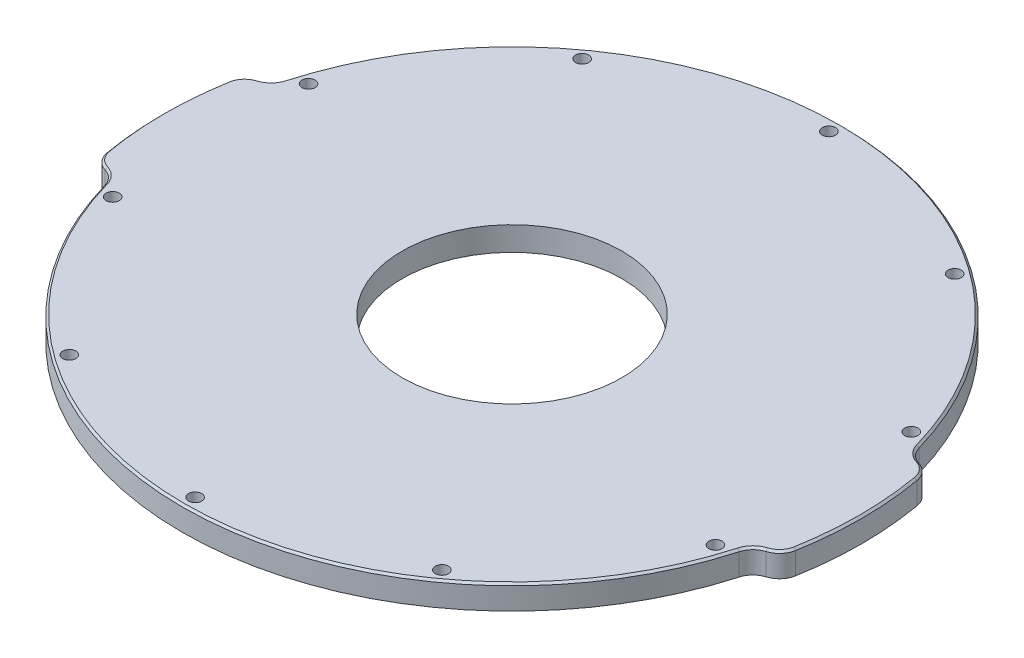
ISO-10303-21;
HEADER;
FILE_DESCRIPTION(('STEP AP214'),'2;1');
FILE_NAME('part.step','',(''),(''),'','','');
FILE_SCHEMA(('AUTOMOTIVE_DESIGN { 1 0 10303 214 1 1 1 1 }'));
ENDSEC;
DATA;
#1=APPLICATION_CONTEXT('core data for automotive mechanical design processes');
#2=APPLICATION_PROTOCOL_DEFINITION('international standard','automotive_design',2000,#1);
#3=PRODUCT_CONTEXT('',#1,'mechanical');
#4=PRODUCT('Part','Part','',(#3));
#5=PRODUCT_RELATED_PRODUCT_CATEGORY('part','',(#4));
#6=PRODUCT_DEFINITION_FORMATION('','',#4);
#7=PRODUCT_DEFINITION_CONTEXT('part definition',#1,'design');
#8=PRODUCT_DEFINITION('design','',#6,#7);
#9=PRODUCT_DEFINITION_SHAPE('','',#8);
#10=(LENGTH_UNIT() NAMED_UNIT(*) SI_UNIT(.MILLI.,.METRE.));
#11=(NAMED_UNIT(*) PLANE_ANGLE_UNIT() SI_UNIT($,.RADIAN.));
#12=(NAMED_UNIT(*) SI_UNIT($,.STERADIAN.) SOLID_ANGLE_UNIT());
#13=UNCERTAINTY_MEASURE_WITH_UNIT(LENGTH_MEASURE(1.E-05),#10,'distance_accuracy_value','');
#14=(GEOMETRIC_REPRESENTATION_CONTEXT(3) GLOBAL_UNCERTAINTY_ASSIGNED_CONTEXT((#13)) GLOBAL_UNIT_ASSIGNED_CONTEXT((#10,
#11,#12)) REPRESENTATION_CONTEXT('',''));
#15=CARTESIAN_POINT('',(0.,0.,0.));
#16=DIRECTION('',(0.,0.,1.));
#17=DIRECTION('',(1.,0.,0.));
#18=AXIS2_PLACEMENT_3D('',#15,#16,#17);
#19=CARTESIAN_POINT('',(-40.6479400055789,6.,-7.16732853320259));
#20=DIRECTION('',(0.,-1.,0.));
#21=DIRECTION('',(0.,0.,-1.));
#22=AXIS2_PLACEMENT_3D('',#19,#20,#21);
#23=PLANE('',#22);
#24=CARTESIAN_POINT('',(0.,6.,0.));
#25=DIRECTION('',(0.,1.,0.));
#26=DIRECTION('',(0.,0.,1.));
#27=AXIS2_PLACEMENT_3D('',#24,#25,#26);
#28=CIRCLE('',#27,27.5);
#29=CARTESIAN_POINT('',(0.,6.,27.5));
#30=VERTEX_POINT('',#29);
#31=EDGE_CURVE('E885',#30,#30,#28,.T.);
#32=ORIENTED_EDGE('',*,*,#31,.F.);
#33=EDGE_LOOP('',(#32));
#34=FACE_BOUND('',#33,.T.);
#35=CARTESIAN_POINT('',(84.2258492187335,6.,-23.8957909135308));
#36=DIRECTION('',(0.,-1.,0.));
#37=DIRECTION('',(0.,0.,-1.));
#38=AXIS2_PLACEMENT_3D('',#35,#36,#37);
#39=CIRCLE('',#38,5.50000000000003);
#40=CARTESIAN_POINT('',(82.6143661545668,6.,-18.6371672976115));
#41=VERTEX_POINT('',#40);
#42=CARTESIAN_POINT('',(78.9346765093898,6.,-22.3946275780149));
#43=VERTEX_POINT('',#42);
#44=EDGE_CURVE('E292',#41,#43,#39,.T.);
#45=ORIENTED_EDGE('',*,*,#44,.T.);
#46=CARTESIAN_POINT('',(0.,6.,0.));
#47=DIRECTION('',(0.,-1.,0.));
#48=DIRECTION('',(0.,0.,-1.));
#49=AXIS2_PLACEMENT_3D('',#46,#47,#48);
#50=CIRCLE('',#49,82.05);
#51=CARTESIAN_POINT('',(-78.9346765093897,6.,-22.3946275780152));
#52=VERTEX_POINT('',#51);
#53=EDGE_CURVE('E298',#43,#52,#50,.F.);
#54=ORIENTED_EDGE('',*,*,#53,.T.);
#55=CARTESIAN_POINT('',(-84.2258492187333,6.,-23.8957909135312));
#56=DIRECTION('',(0.,-1.,0.));
#57=DIRECTION('',(0.,0.,-1.));
#58=AXIS2_PLACEMENT_3D('',#55,#56,#57);
#59=CIRCLE('',#58,5.50000000000004);
#60=CARTESIAN_POINT('',(-82.6143661545668,6.,-18.6371672976118));
#61=VERTEX_POINT('',#60);
#62=EDGE_CURVE('E295',#52,#61,#59,.T.);
#63=ORIENTED_EDGE('',*,*,#62,.T.);
#64=CARTESIAN_POINT('',(-81.2958800111578,6.,-14.3346570664051));
#65=DIRECTION('',(0.,-1.,0.));
#66=DIRECTION('',(0.,0.,-1.));
#67=AXIS2_PLACEMENT_3D('',#64,#65,#66);
#68=CIRCLE('',#67,4.49999999999997);
#69=CARTESIAN_POINT('',(-85.7275148997127,6.,-15.1160738659063));
#70=VERTEX_POINT('',#69);
#71=EDGE_CURVE('E289',#61,#70,#68,.F.);
#72=ORIENTED_EDGE('',*,*,#71,.T.);
#73=CARTESIAN_POINT('',(0.,6.,0.));
#74=DIRECTION('',(0.,-1.,0.));
#75=DIRECTION('',(0.,0.,-1.));
#76=AXIS2_PLACEMENT_3D('',#73,#74,#75);
#77=CIRCLE('',#76,87.05);
#78=CARTESIAN_POINT('',(-85.7275148997127,6.,15.1160738659063));
#79=VERTEX_POINT('',#78);
#80=EDGE_CURVE('E283',#70,#79,#77,.F.);
#81=ORIENTED_EDGE('',*,*,#80,.T.);
#82=CARTESIAN_POINT('',(-81.2958800111578,6.,14.3346570664051));
#83=DIRECTION('',(0.,-1.,0.));
#84=DIRECTION('',(0.,0.,-1.));
#85=AXIS2_PLACEMENT_3D('',#82,#83,#84);
#86=CIRCLE('',#85,4.49999999999997);
#87=CARTESIAN_POINT('',(-82.6143661545668,6.,18.6371672976118));
#88=VERTEX_POINT('',#87);
#89=EDGE_CURVE('E278',#79,#88,#86,.F.);
#90=ORIENTED_EDGE('',*,*,#89,.T.);
#91=CARTESIAN_POINT('',(-84.2258492187333,6.,23.8957909135312));
#92=DIRECTION('',(0.,-1.,0.));
#93=DIRECTION('',(0.,0.,-1.));
#94=AXIS2_PLACEMENT_3D('',#91,#92,#93);
#95=CIRCLE('',#94,5.50000000000003);
#96=CARTESIAN_POINT('',(-78.9346765093897,6.,22.3946275780152));
#97=VERTEX_POINT('',#96);
#98=EDGE_CURVE('E272',#88,#97,#95,.T.);
#99=ORIENTED_EDGE('',*,*,#98,.T.);
#100=CARTESIAN_POINT('',(0.,6.,-4.92661467177413E-13));
#101=DIRECTION('',(0.,-1.,0.));
#102=DIRECTION('',(0.,0.,-1.));
#103=AXIS2_PLACEMENT_3D('',#100,#101,#102);
#104=CIRCLE('',#103,82.0500000000001);
#105=CARTESIAN_POINT('',(78.9346765093897,6.,22.3946275780149));
#106=VERTEX_POINT('',#105);
#107=EDGE_CURVE('E266',#97,#106,#104,.F.);
#108=ORIENTED_EDGE('',*,*,#107,.T.);
#109=CARTESIAN_POINT('',(84.2258492187334,6.,23.8957909135309));
#110=DIRECTION('',(0.,-1.,0.));
#111=DIRECTION('',(0.,0.,-1.));
#112=AXIS2_PLACEMENT_3D('',#109,#110,#111);
#113=CIRCLE('',#112,5.50000000000003);
#114=CARTESIAN_POINT('',(82.6143661545668,6.,18.6371672976115));
#115=VERTEX_POINT('',#114);
#116=EDGE_CURVE('E269',#106,#115,#113,.T.);
#117=ORIENTED_EDGE('',*,*,#116,.T.);
#118=CARTESIAN_POINT('',(81.2958800111578,6.,14.3346570664051));
#119=DIRECTION('',(0.,-1.,0.));
#120=DIRECTION('',(0.,0.,-1.));
#121=AXIS2_PLACEMENT_3D('',#118,#119,#120);
#122=CIRCLE('',#121,4.49999999999971);
#123=CARTESIAN_POINT('',(85.7275148997124,6.,15.1160738659063));
#124=VERTEX_POINT('',#123);
#125=EDGE_CURVE('E275',#115,#124,#122,.F.);
#126=ORIENTED_EDGE('',*,*,#125,.T.);
#127=CARTESIAN_POINT('',(-1.29063426612674E-12,6.,0.));
#128=DIRECTION('',(0.,-1.,0.));
#129=DIRECTION('',(0.,0.,-1.));
#130=AXIS2_PLACEMENT_3D('',#127,#128,#129);
#131=CIRCLE('',#130,87.050000000001);
#132=CARTESIAN_POINT('',(85.7275148997124,6.,-15.1160738659063));
#133=VERTEX_POINT('',#132);
#134=EDGE_CURVE('E281',#124,#133,#131,.F.);
#135=ORIENTED_EDGE('',*,*,#134,.T.);
#136=CARTESIAN_POINT('',(81.2958800111578,6.,-14.3346570664051));
#137=DIRECTION('',(0.,-1.,0.));
#138=DIRECTION('',(0.,0.,-1.));
#139=AXIS2_PLACEMENT_3D('',#136,#137,#138);
#140=CIRCLE('',#139,4.49999999999971);
#141=EDGE_CURVE('E286',#133,#41,#140,.F.);
#142=ORIENTED_EDGE('',*,*,#141,.T.);
#143=EDGE_LOOP('',(#45,#54,#63,#72,#81,#90,#99,#108,#117,#126,#135,#142));
#144=FACE_BOUND('',#143,.T.);
#145=CARTESIAN_POINT('',(-75.4663345680205,6.,-24.5204985036521));
#146=DIRECTION('',(0.,1.,0.));
#147=DIRECTION('',(0.,0.,1.));
#148=AXIS2_PLACEMENT_3D('',#145,#146,#147);
#149=CIRCLE('',#148,1.6500000000009);
#150=CARTESIAN_POINT('',(-75.4663345680205,6.,-22.8704985036512));
#151=VERTEX_POINT('',#150);
#152=EDGE_CURVE('E398',#151,#151,#149,.T.);
#153=ORIENTED_EDGE('',*,*,#152,.F.);
#154=EDGE_LOOP('',(#153));
#155=FACE_BOUND('',#154,.T.);
#156=CARTESIAN_POINT('',(-46.6407597694078,6.,64.1954985036521));
#157=DIRECTION('',(0.,1.,0.));
#158=DIRECTION('',(0.,0.,1.));
#159=AXIS2_PLACEMENT_3D('',#156,#157,#158);
#160=CIRCLE('',#159,1.65000000000068);
#161=CARTESIAN_POINT('',(-46.6407597694078,6.,65.8454985036528));
#162=VERTEX_POINT('',#161);
#163=EDGE_CURVE('E414',#162,#162,#160,.T.);
#164=ORIENTED_EDGE('',*,*,#163,.F.);
#165=EDGE_LOOP('',(#164));
#166=FACE_BOUND('',#165,.T.);
#167=CARTESIAN_POINT('',(46.6407597694077,6.,64.1954985036521));
#168=DIRECTION('',(0.,1.,0.));
#169=DIRECTION('',(0.,0.,1.));
#170=AXIS2_PLACEMENT_3D('',#167,#168,#169);
#171=CIRCLE('',#170,1.65000000000041);
#172=CARTESIAN_POINT('',(46.6407597694077,6.,65.8454985036525));
#173=VERTEX_POINT('',#172);
#174=EDGE_CURVE('E429',#173,#173,#171,.T.);
#175=ORIENTED_EDGE('',*,*,#174,.F.);
#176=EDGE_LOOP('',(#175));
#177=FACE_BOUND('',#176,.T.);
#178=CARTESIAN_POINT('',(75.4663345680204,6.,-24.5204985036521));
#179=DIRECTION('',(0.,1.,0.));
#180=DIRECTION('',(0.,0.,1.));
#181=AXIS2_PLACEMENT_3D('',#178,#179,#180);
#182=CIRCLE('',#181,1.65000000000021);
#183=CARTESIAN_POINT('',(75.4663345680204,6.,-22.8704985036519));
#184=VERTEX_POINT('',#183);
#185=EDGE_CURVE('E445',#184,#184,#182,.T.);
#186=ORIENTED_EDGE('',*,*,#185,.F.);
#187=EDGE_LOOP('',(#186));
#188=FACE_BOUND('',#187,.T.);
#189=CARTESIAN_POINT('',(0.,6.,-79.35));
#190=DIRECTION('',(0.,1.,0.));
#191=DIRECTION('',(0.,0.,1.));
#192=AXIS2_PLACEMENT_3D('',#189,#190,#191);
#193=CIRCLE('',#192,1.65);
#194=CARTESIAN_POINT('',(0.,6.,-77.7));
#195=VERTEX_POINT('',#194);
#196=EDGE_CURVE('E188',#195,#195,#193,.T.);
#197=ORIENTED_EDGE('',*,*,#196,.F.);
#198=EDGE_LOOP('',(#197));
#199=FACE_BOUND('',#198,.T.);
#200=CARTESIAN_POINT('',(46.6407597694078,6.,-64.1954985036521));
#201=DIRECTION('',(0.,1.,0.));
#202=DIRECTION('',(0.,0.,1.));
#203=AXIS2_PLACEMENT_3D('',#200,#201,#202);
#204=CIRCLE('',#203,1.65000000000012);
#205=CARTESIAN_POINT('',(46.6407597694078,6.,-62.5454985036519));
#206=VERTEX_POINT('',#205);
#207=EDGE_CURVE('E453',#206,#206,#204,.T.);
#208=ORIENTED_EDGE('',*,*,#207,.F.);
#209=EDGE_LOOP('',(#208));
#210=FACE_BOUND('',#209,.T.);
#211=CARTESIAN_POINT('',(75.4663345680204,6.,24.5204985036521));
#212=DIRECTION('',(0.,1.,0.));
#213=DIRECTION('',(0.,0.,1.));
#214=AXIS2_PLACEMENT_3D('',#211,#212,#213);
#215=CIRCLE('',#214,1.65000000000032);
#216=CARTESIAN_POINT('',(75.4663345680204,6.,26.1704985036524));
#217=VERTEX_POINT('',#216);
#218=EDGE_CURVE('E437',#217,#217,#215,.T.);
#219=ORIENTED_EDGE('',*,*,#218,.F.);
#220=EDGE_LOOP('',(#219));
#221=FACE_BOUND('',#220,.T.);
#222=CARTESIAN_POINT('',(0.,6.,79.35));
#223=DIRECTION('',(0.,1.,0.));
#224=DIRECTION('',(0.,0.,1.));
#225=AXIS2_PLACEMENT_3D('',#222,#223,#224);
#226=CIRCLE('',#225,1.65000000000052);
#227=CARTESIAN_POINT('',(0.,6.,81.0000000000005));
#228=VERTEX_POINT('',#227);
#229=EDGE_CURVE('E422',#228,#228,#226,.T.);
#230=ORIENTED_EDGE('',*,*,#229,.F.);
#231=EDGE_LOOP('',(#230));
#232=FACE_BOUND('',#231,.T.);
#233=CARTESIAN_POINT('',(-75.4663345680204,6.,24.5204985036521));
#234=DIRECTION('',(0.,1.,0.));
#235=DIRECTION('',(0.,0.,1.));
#236=AXIS2_PLACEMENT_3D('',#233,#234,#235);
#237=CIRCLE('',#236,1.65000000000073);
#238=CARTESIAN_POINT('',(-75.4663345680204,6.,26.1704985036528));
#239=VERTEX_POINT('',#238);
#240=EDGE_CURVE('E406',#239,#239,#237,.T.);
#241=ORIENTED_EDGE('',*,*,#240,.F.);
#242=EDGE_LOOP('',(#241));
#243=FACE_BOUND('',#242,.T.);
#244=CARTESIAN_POINT('',(-46.6407597694078,6.,-64.1954985036521));
#245=DIRECTION('',(0.,1.,0.));
#246=DIRECTION('',(0.,0.,1.));
#247=AXIS2_PLACEMENT_3D('',#244,#245,#246);
#248=CIRCLE('',#247,1.65000000000102);
#249=CARTESIAN_POINT('',(-46.6407597694078,6.,-62.545498503651));
#250=VERTEX_POINT('',#249);
#251=EDGE_CURVE('E387',#250,#250,#248,.T.);
#252=ORIENTED_EDGE('',*,*,#251,.F.);
#253=EDGE_LOOP('',(#252));
#254=FACE_BOUND('',#253,.T.);
#255=ADVANCED_FACE('F38',(#34,#144,#155,#166,#177,#188,#199,#210,#221,#232,#243,#254),#23,.F.);
#256=CARTESIAN_POINT('',(-40.6479400055789,0.,-7.16732853320259));
#257=DIRECTION('',(0.,-1.,0.));
#258=DIRECTION('',(0.,0.,-1.));
#259=AXIS2_PLACEMENT_3D('',#256,#257,#258);
#260=PLANE('',#259);
#261=CARTESIAN_POINT('',(0.,0.,0.));
#262=DIRECTION('',(0.,1.,0.));
#263=DIRECTION('',(0.,0.,1.));
#264=AXIS2_PLACEMENT_3D('',#261,#262,#263);
#265=CIRCLE('',#264,27.5);
#266=CARTESIAN_POINT('',(0.,0.,27.5));
#267=VERTEX_POINT('',#266);
#268=EDGE_CURVE('E338',#267,#267,#265,.T.);
#269=ORIENTED_EDGE('',*,*,#268,.T.);
#270=EDGE_LOOP('',(#269));
#271=FACE_BOUND('',#270,.T.);
#272=CARTESIAN_POINT('',(-75.4663345680205,0.,-24.5204985036521));
#273=DIRECTION('',(0.,1.,0.));
#274=DIRECTION('',(0.,0.,1.));
#275=AXIS2_PLACEMENT_3D('',#272,#273,#274);
#276=CIRCLE('',#275,1.6500000000009);
#277=CARTESIAN_POINT('',(-75.4663345680205,0.,-22.8704985036512));
#278=VERTEX_POINT('',#277);
#279=EDGE_CURVE('E394',#278,#278,#276,.T.);
#280=ORIENTED_EDGE('',*,*,#279,.T.);
#281=EDGE_LOOP('',(#280));
#282=FACE_BOUND('',#281,.T.);
#283=CARTESIAN_POINT('',(-46.6407597694078,0.,64.1954985036521));
#284=DIRECTION('',(0.,1.,0.));
#285=DIRECTION('',(0.,0.,1.));
#286=AXIS2_PLACEMENT_3D('',#283,#284,#285);
#287=CIRCLE('',#286,1.65000000000068);
#288=CARTESIAN_POINT('',(-46.6407597694078,0.,65.8454985036528));
#289=VERTEX_POINT('',#288);
#290=EDGE_CURVE('E410',#289,#289,#287,.T.);
#291=ORIENTED_EDGE('',*,*,#290,.T.);
#292=EDGE_LOOP('',(#291));
#293=FACE_BOUND('',#292,.T.);
#294=CARTESIAN_POINT('',(46.6407597694077,0.,64.1954985036521));
#295=DIRECTION('',(0.,1.,0.));
#296=DIRECTION('',(0.,0.,1.));
#297=AXIS2_PLACEMENT_3D('',#294,#295,#296);
#298=CIRCLE('',#297,1.65000000000041);
#299=CARTESIAN_POINT('',(46.6407597694077,0.,65.8454985036525));
#300=VERTEX_POINT('',#299);
#301=EDGE_CURVE('E425',#300,#300,#298,.T.);
#302=ORIENTED_EDGE('',*,*,#301,.T.);
#303=EDGE_LOOP('',(#302));
#304=FACE_BOUND('',#303,.T.);
#305=CARTESIAN_POINT('',(75.4663345680204,0.,-24.5204985036521));
#306=DIRECTION('',(0.,1.,0.));
#307=DIRECTION('',(0.,0.,1.));
#308=AXIS2_PLACEMENT_3D('',#305,#306,#307);
#309=CIRCLE('',#308,1.65000000000021);
#310=CARTESIAN_POINT('',(75.4663345680204,0.,-22.8704985036519));
#311=VERTEX_POINT('',#310);
#312=EDGE_CURVE('E441',#311,#311,#309,.T.);
#313=ORIENTED_EDGE('',*,*,#312,.T.);
#314=EDGE_LOOP('',(#313));
#315=FACE_BOUND('',#314,.T.);
#316=CARTESIAN_POINT('',(0.,0.,-79.35));
#317=DIRECTION('',(0.,1.,0.));
#318=DIRECTION('',(0.,0.,1.));
#319=AXIS2_PLACEMENT_3D('',#316,#317,#318);
#320=CIRCLE('',#319,1.65);
#321=CARTESIAN_POINT('',(0.,0.,-77.7));
#322=VERTEX_POINT('',#321);
#323=EDGE_CURVE('E457',#322,#322,#320,.T.);
#324=ORIENTED_EDGE('',*,*,#323,.T.);
#325=EDGE_LOOP('',(#324));
#326=FACE_BOUND('',#325,.T.);
#327=CARTESIAN_POINT('',(-81.2958800111578,0.,-14.3346570664051));
#328=DIRECTION('',(0.,1.,0.));
#329=DIRECTION('',(0.,0.,-1.));
#330=AXIS2_PLACEMENT_3D('',#327,#328,#329);
#331=CIRCLE('',#330,5.00000000000001);
#332=CARTESIAN_POINT('',(-82.7608646149456,0.,-19.1152239899681));
#333=VERTEX_POINT('',#332);
#334=CARTESIAN_POINT('',(-86.2199187762188,0.,-15.2028979547397));
#335=VERTEX_POINT('',#334);
#336=EDGE_CURVE('E181',#333,#335,#331,.T.);
#337=ORIENTED_EDGE('',*,*,#336,.F.);
#338=CARTESIAN_POINT('',(-84.2258492187333,0.,-23.8957909135312));
#339=DIRECTION('',(0.,-1.,0.));
#340=DIRECTION('',(0.,0.,-1.));
#341=AXIS2_PLACEMENT_3D('',#338,#339,#340);
#342=CIRCLE('',#341,5.);
#343=CARTESIAN_POINT('',(-79.4156922102391,0.,-22.531096972153));
#344=VERTEX_POINT('',#343);
#345=EDGE_CURVE('E260',#333,#344,#342,.F.);
#346=ORIENTED_EDGE('',*,*,#345,.T.);
#347=CARTESIAN_POINT('',(0.,0.,0.));
#348=DIRECTION('',(0.,1.,0.));
#349=DIRECTION('',(0.,0.,-1.));
#350=AXIS2_PLACEMENT_3D('',#347,#348,#349);
#351=CIRCLE('',#350,82.55);
#352=CARTESIAN_POINT('',(79.4156922102393,0.,-22.5310969721527));
#353=VERTEX_POINT('',#352);
#354=EDGE_CURVE('E217',#353,#344,#351,.T.);
#355=ORIENTED_EDGE('',*,*,#354,.F.);
#356=CARTESIAN_POINT('',(84.2258492187335,0.,-23.8957909135308));
#357=DIRECTION('',(0.,-1.,0.));
#358=DIRECTION('',(0.,0.,-1.));
#359=AXIS2_PLACEMENT_3D('',#356,#357,#358);
#360=CIRCLE('',#359,5.);
#361=CARTESIAN_POINT('',(82.7608646149456,0.,-19.1152239899679));
#362=VERTEX_POINT('',#361);
#363=EDGE_CURVE('E257',#353,#362,#360,.F.);
#364=ORIENTED_EDGE('',*,*,#363,.T.);
#365=CARTESIAN_POINT('',(81.2958800111578,0.,-14.3346570664051));
#366=DIRECTION('',(0.,1.,0.));
#367=DIRECTION('',(0.,0.,1.));
#368=AXIS2_PLACEMENT_3D('',#365,#366,#367);
#369=CIRCLE('',#368,4.99999999999974);
#370=CARTESIAN_POINT('',(86.2199187762185,0.,-15.2028979547397));
#371=VERTEX_POINT('',#370);
#372=EDGE_CURVE('E213',#371,#362,#369,.T.);
#373=ORIENTED_EDGE('',*,*,#372,.F.);
#374=CARTESIAN_POINT('',(-1.29063426612674E-12,0.,0.));
#375=DIRECTION('',(0.,1.,0.));
#376=DIRECTION('',(0.,0.,1.));
#377=AXIS2_PLACEMENT_3D('',#374,#375,#376);
#378=CIRCLE('',#377,87.550000000001);
#379=CARTESIAN_POINT('',(86.2199187762186,0.,15.2028979547397));
#380=VERTEX_POINT('',#379);
#381=EDGE_CURVE('E209',#380,#371,#378,.T.);
#382=ORIENTED_EDGE('',*,*,#381,.F.);
#383=CARTESIAN_POINT('',(81.2958800111578,0.,14.3346570664051));
#384=DIRECTION('',(0.,1.,0.));
#385=DIRECTION('',(0.,0.,-1.));
#386=AXIS2_PLACEMENT_3D('',#383,#384,#385);
#387=CIRCLE('',#386,4.99999999999974);
#388=CARTESIAN_POINT('',(82.7608646149456,0.,19.1152239899679));
#389=VERTEX_POINT('',#388);
#390=EDGE_CURVE('E205',#389,#380,#387,.T.);
#391=ORIENTED_EDGE('',*,*,#390,.F.);
#392=CARTESIAN_POINT('',(84.2258492187334,0.,23.8957909135309));
#393=DIRECTION('',(0.,-1.,0.));
#394=DIRECTION('',(0.,0.,-1.));
#395=AXIS2_PLACEMENT_3D('',#392,#393,#394);
#396=CIRCLE('',#395,5.);
#397=CARTESIAN_POINT('',(79.4156922102392,0.,22.5310969721527));
#398=VERTEX_POINT('',#397);
#399=EDGE_CURVE('E254',#389,#398,#396,.F.);
#400=ORIENTED_EDGE('',*,*,#399,.T.);
#401=CARTESIAN_POINT('',(0.,0.,-4.92661467177413E-13));
#402=DIRECTION('',(0.,1.,0.));
#403=DIRECTION('',(0.,0.,-1.));
#404=AXIS2_PLACEMENT_3D('',#401,#402,#403);
#405=CIRCLE('',#404,82.5500000000001);
#406=CARTESIAN_POINT('',(-79.4156922102391,0.,22.531096972153));
#407=VERTEX_POINT('',#406);
#408=EDGE_CURVE('E198',#407,#398,#405,.T.);
#409=ORIENTED_EDGE('',*,*,#408,.F.);
#410=CARTESIAN_POINT('',(-84.2258492187333,0.,23.8957909135312));
#411=DIRECTION('',(0.,-1.,0.));
#412=DIRECTION('',(0.,0.,-1.));
#413=AXIS2_PLACEMENT_3D('',#410,#411,#412);
#414=CIRCLE('',#413,5.);
#415=CARTESIAN_POINT('',(-82.7608646149455,0.,19.1152239899681));
#416=VERTEX_POINT('',#415);
#417=EDGE_CURVE('E263',#407,#416,#414,.F.);
#418=ORIENTED_EDGE('',*,*,#417,.T.);
#419=CARTESIAN_POINT('',(-81.2958800111578,0.,14.3346570664051));
#420=DIRECTION('',(0.,1.,0.));
#421=DIRECTION('',(0.,0.,1.));
#422=AXIS2_PLACEMENT_3D('',#419,#420,#421);
#423=CIRCLE('',#422,5.00000000000001);
#424=CARTESIAN_POINT('',(-86.2199187762188,0.,15.2028979547398));
#425=VERTEX_POINT('',#424);
#426=EDGE_CURVE('E193',#425,#416,#423,.T.);
#427=ORIENTED_EDGE('',*,*,#426,.F.);
#428=CARTESIAN_POINT('',(0.,0.,0.));
#429=DIRECTION('',(0.,1.,0.));
#430=DIRECTION('',(0.,0.,-1.));
#431=AXIS2_PLACEMENT_3D('',#428,#429,#430);
#432=CIRCLE('',#431,87.55);
#433=EDGE_CURVE('E170',#335,#425,#432,.T.);
#434=ORIENTED_EDGE('',*,*,#433,.F.);
#435=EDGE_LOOP('',(#337,#346,#355,#364,#373,#382,#391,#400,#409,#418,#427,#434));
#436=FACE_BOUND('',#435,.T.);
#437=CARTESIAN_POINT('',(46.6407597694078,0.,-64.1954985036521));
#438=DIRECTION('',(0.,1.,0.));
#439=DIRECTION('',(0.,0.,1.));
#440=AXIS2_PLACEMENT_3D('',#437,#438,#439);
#441=CIRCLE('',#440,1.65000000000012);
#442=CARTESIAN_POINT('',(46.6407597694078,0.,-62.5454985036519));
#443=VERTEX_POINT('',#442);
#444=EDGE_CURVE('E449',#443,#443,#441,.T.);
#445=ORIENTED_EDGE('',*,*,#444,.T.);
#446=EDGE_LOOP('',(#445));
#447=FACE_BOUND('',#446,.T.);
#448=CARTESIAN_POINT('',(75.4663345680204,0.,24.5204985036521));
#449=DIRECTION('',(0.,1.,0.));
#450=DIRECTION('',(0.,0.,1.));
#451=AXIS2_PLACEMENT_3D('',#448,#449,#450);
#452=CIRCLE('',#451,1.65000000000032);
#453=CARTESIAN_POINT('',(75.4663345680204,0.,26.1704985036524));
#454=VERTEX_POINT('',#453);
#455=EDGE_CURVE('E433',#454,#454,#452,.T.);
#456=ORIENTED_EDGE('',*,*,#455,.T.);
#457=EDGE_LOOP('',(#456));
#458=FACE_BOUND('',#457,.T.);
#459=CARTESIAN_POINT('',(0.,0.,79.35));
#460=DIRECTION('',(0.,1.,0.));
#461=DIRECTION('',(0.,0.,1.));
#462=AXIS2_PLACEMENT_3D('',#459,#460,#461);
#463=CIRCLE('',#462,1.65000000000052);
#464=CARTESIAN_POINT('',(0.,0.,81.0000000000005));
#465=VERTEX_POINT('',#464);
#466=EDGE_CURVE('E418',#465,#465,#463,.T.);
#467=ORIENTED_EDGE('',*,*,#466,.T.);
#468=EDGE_LOOP('',(#467));
#469=FACE_BOUND('',#468,.T.);
#470=CARTESIAN_POINT('',(-75.4663345680204,0.,24.5204985036521));
#471=DIRECTION('',(0.,1.,0.));
#472=DIRECTION('',(0.,0.,1.));
#473=AXIS2_PLACEMENT_3D('',#470,#471,#472);
#474=CIRCLE('',#473,1.65000000000073);
#475=CARTESIAN_POINT('',(-75.4663345680204,0.,26.1704985036528));
#476=VERTEX_POINT('',#475);
#477=EDGE_CURVE('E402',#476,#476,#474,.T.);
#478=ORIENTED_EDGE('',*,*,#477,.T.);
#479=EDGE_LOOP('',(#478));
#480=FACE_BOUND('',#479,.T.);
#481=CARTESIAN_POINT('',(-46.6407597694078,0.,-64.1954985036521));
#482=DIRECTION('',(0.,1.,0.));
#483=DIRECTION('',(0.,0.,1.));
#484=AXIS2_PLACEMENT_3D('',#481,#482,#483);
#485=CIRCLE('',#484,1.65000000000102);
#486=CARTESIAN_POINT('',(-46.6407597694078,0.,-62.545498503651));
#487=VERTEX_POINT('',#486);
#488=EDGE_CURVE('E381',#487,#487,#485,.T.);
#489=ORIENTED_EDGE('',*,*,#488,.T.);
#490=EDGE_LOOP('',(#489));
#491=FACE_BOUND('',#490,.T.);
#492=ADVANCED_FACE('F190',(#271,#282,#293,#304,#315,#326,#436,#447,#458,#469,#480,#491),#260,.T.);
#493=CARTESIAN_POINT('',(-81.2958800111578,6.,-14.3346570664051));
#494=DIRECTION('',(0.,-1.,0.));
#495=DIRECTION('',(0.,0.,-1.));
#496=AXIS2_PLACEMENT_3D('',#493,#494,#495);
#497=CYLINDRICAL_SURFACE('',#496,5.00000000000001);
#498=DIRECTION('',(0.,-1.,0.));
#499=VECTOR('',#498,1.);
#500=CARTESIAN_POINT('',(-86.2199187762188,6.,-15.2028979547397));
#501=LINE('',#500,#499);
#502=CARTESIAN_POINT('',(-86.2199187762188,5.49999999999994,-15.2028979547397));
#503=VERTEX_POINT('',#502);
#504=EDGE_CURVE('E165',#503,#335,#501,.T.);
#505=ORIENTED_EDGE('',*,*,#504,.F.);
#506=CARTESIAN_POINT('',(-81.2958800111578,5.49999999999994,-14.3346570664051));
#507=DIRECTION('',(0.,-1.,0.));
#508=DIRECTION('',(0.,0.,-1.));
#509=AXIS2_PLACEMENT_3D('',#506,#507,#508);
#510=CIRCLE('',#509,5.00000000000001);
#511=CARTESIAN_POINT('',(-82.7608646149456,5.49999999999994,-19.1152239899681));
#512=VERTEX_POINT('',#511);
#513=EDGE_CURVE('E312',#503,#512,#510,.T.);
#514=ORIENTED_EDGE('',*,*,#513,.T.);
#515=DIRECTION('',(0.,-1.,0.));
#516=VECTOR('',#515,1.);
#517=CARTESIAN_POINT('',(-82.7608646149456,6.,-19.1152239899681));
#518=LINE('',#517,#516);
#519=EDGE_CURVE('E184',#512,#333,#518,.T.);
#520=ORIENTED_EDGE('',*,*,#519,.T.);
#521=ORIENTED_EDGE('',*,*,#336,.T.);
#522=EDGE_LOOP('',(#505,#514,#520,#521));
#523=FACE_BOUND('',#522,.T.);
#524=ADVANCED_FACE('F182',(#523),#497,.T.);
#525=CARTESIAN_POINT('',(0.,6.,0.));
#526=DIRECTION('',(0.,-1.,0.));
#527=DIRECTION('',(0.,0.,-1.));
#528=AXIS2_PLACEMENT_3D('',#525,#526,#527);
#529=CYLINDRICAL_SURFACE('',#528,87.55);
#530=DIRECTION('',(0.,-1.,0.));
#531=VECTOR('',#530,1.);
#532=CARTESIAN_POINT('',(-86.2199187762188,6.,15.2028979547398));
#533=LINE('',#532,#531);
#534=CARTESIAN_POINT('',(-86.2199187762188,5.49999999999994,15.2028979547398));
#535=VERTEX_POINT('',#534);
#536=EDGE_CURVE('E178',#535,#425,#533,.T.);
#537=ORIENTED_EDGE('',*,*,#536,.F.);
#538=CARTESIAN_POINT('',(0.,5.49999999999994,0.));
#539=DIRECTION('',(0.,-1.,0.));
#540=DIRECTION('',(0.,0.,-1.));
#541=AXIS2_PLACEMENT_3D('',#538,#539,#540);
#542=CIRCLE('',#541,87.55);
#543=EDGE_CURVE('E173',#535,#503,#542,.T.);
#544=ORIENTED_EDGE('',*,*,#543,.T.);
#545=ORIENTED_EDGE('',*,*,#504,.T.);
#546=ORIENTED_EDGE('',*,*,#433,.T.);
#547=EDGE_LOOP('',(#537,#544,#545,#546));
#548=FACE_BOUND('',#547,.T.);
#549=ADVANCED_FACE('F168',(#548),#529,.T.);
#550=CARTESIAN_POINT('',(-81.2958800111578,6.,14.3346570664051));
#551=DIRECTION('',(0.,-1.,0.));
#552=DIRECTION('',(0.,0.,-1.));
#553=AXIS2_PLACEMENT_3D('',#550,#551,#552);
#554=CYLINDRICAL_SURFACE('',#553,5.00000000000001);
#555=DIRECTION('',(0.,-1.,0.));
#556=VECTOR('',#555,1.);
#557=CARTESIAN_POINT('',(-82.7608646149455,6.,19.1152239899681));
#558=LINE('',#557,#556);
#559=CARTESIAN_POINT('',(-82.7608646149455,5.49999999999994,19.1152239899681));
#560=VERTEX_POINT('',#559);
#561=EDGE_CURVE('E250',#416,#560,#558,.F.);
#562=ORIENTED_EDGE('',*,*,#561,.T.);
#563=CARTESIAN_POINT('',(-81.2958800111578,5.49999999999994,14.3346570664051));
#564=DIRECTION('',(0.,-1.,0.));
#565=DIRECTION('',(0.,0.,-1.));
#566=AXIS2_PLACEMENT_3D('',#563,#564,#565);
#567=CIRCLE('',#566,5.00000000000001);
#568=EDGE_CURVE('E323',#560,#535,#567,.T.);
#569=ORIENTED_EDGE('',*,*,#568,.T.);
#570=ORIENTED_EDGE('',*,*,#536,.T.);
#571=ORIENTED_EDGE('',*,*,#426,.T.);
#572=EDGE_LOOP('',(#562,#569,#570,#571));
#573=FACE_BOUND('',#572,.T.);
#574=ADVANCED_FACE('F509',(#573),#554,.T.);
#575=CARTESIAN_POINT('',(0.,6.,-4.92661467177413E-13));
#576=DIRECTION('',(0.,-1.,0.));
#577=DIRECTION('',(0.,0.,-1.));
#578=AXIS2_PLACEMENT_3D('',#575,#576,#577);
#579=CYLINDRICAL_SURFACE('',#578,82.5500000000001);
#580=DIRECTION('',(0.,-1.,0.));
#581=VECTOR('',#580,1.);
#582=CARTESIAN_POINT('',(79.4156922102392,6.,22.5310969721527));
#583=LINE('',#582,#581);
#584=CARTESIAN_POINT('',(79.4156922102392,5.49999999999994,22.5310969721527));
#585=VERTEX_POINT('',#584);
#586=EDGE_CURVE('E234',#398,#585,#583,.F.);
#587=ORIENTED_EDGE('',*,*,#586,.T.);
#588=CARTESIAN_POINT('',(0.,5.49999999999994,-4.92661467177413E-13));
#589=DIRECTION('',(0.,-1.,0.));
#590=DIRECTION('',(0.,0.,-1.));
#591=AXIS2_PLACEMENT_3D('',#588,#589,#590);
#592=CIRCLE('',#591,82.5500000000001);
#593=CARTESIAN_POINT('',(-79.4156922102391,5.49999999999994,22.531096972153));
#594=VERTEX_POINT('',#593);
#595=EDGE_CURVE('E11',#585,#594,#592,.T.);
#596=ORIENTED_EDGE('',*,*,#595,.T.);
#597=DIRECTION('',(0.,-1.,0.));
#598=VECTOR('',#597,1.);
#599=CARTESIAN_POINT('',(-79.4156922102391,6.,22.531096972153));
#600=LINE('',#599,#598);
#601=EDGE_CURVE('E231',#594,#407,#600,.T.);
#602=ORIENTED_EDGE('',*,*,#601,.T.);
#603=ORIENTED_EDGE('',*,*,#408,.T.);
#604=EDGE_LOOP('',(#587,#596,#602,#603));
#605=FACE_BOUND('',#604,.T.);
#606=ADVANCED_FACE('F505',(#605),#579,.T.);
#607=CARTESIAN_POINT('',(81.2958800111578,6.,14.3346570664051));
#608=DIRECTION('',(0.,-1.,0.));
#609=DIRECTION('',(0.,0.,-1.));
#610=AXIS2_PLACEMENT_3D('',#607,#608,#609);
#611=CYLINDRICAL_SURFACE('',#610,4.99999999999974);
#612=DIRECTION('',(0.,-1.,0.));
#613=VECTOR('',#612,1.);
#614=CARTESIAN_POINT('',(86.2199187762186,6.,15.2028979547397));
#615=LINE('',#614,#613);
#616=CARTESIAN_POINT('',(86.2199187762186,5.49999999999994,15.2028979547397));
#617=VERTEX_POINT('',#616);
#618=EDGE_CURVE('E224',#617,#380,#615,.T.);
#619=ORIENTED_EDGE('',*,*,#618,.F.);
#620=CARTESIAN_POINT('',(81.2958800111578,5.49999999999994,14.3346570664051));
#621=DIRECTION('',(0.,-1.,0.));
#622=DIRECTION('',(0.,0.,-1.));
#623=AXIS2_PLACEMENT_3D('',#620,#621,#622);
#624=CIRCLE('',#623,4.99999999999974);
#625=CARTESIAN_POINT('',(82.7608646149456,5.49999999999994,19.1152239899679));
#626=VERTEX_POINT('',#625);
#627=EDGE_CURVE('E326',#617,#626,#624,.T.);
#628=ORIENTED_EDGE('',*,*,#627,.T.);
#629=DIRECTION('',(0.,-1.,0.));
#630=VECTOR('',#629,1.);
#631=CARTESIAN_POINT('',(82.7608646149456,6.,19.1152239899679));
#632=LINE('',#631,#630);
#633=EDGE_CURVE('E177',#626,#389,#632,.T.);
#634=ORIENTED_EDGE('',*,*,#633,.T.);
#635=ORIENTED_EDGE('',*,*,#390,.T.);
#636=EDGE_LOOP('',(#619,#628,#634,#635));
#637=FACE_BOUND('',#636,.T.);
#638=ADVANCED_FACE('F501',(#637),#611,.T.);
#639=CARTESIAN_POINT('',(-1.29063426612674E-12,6.,0.));
#640=DIRECTION('',(0.,-1.,0.));
#641=DIRECTION('',(0.,0.,-1.));
#642=AXIS2_PLACEMENT_3D('',#639,#640,#641);
#643=CYLINDRICAL_SURFACE('',#642,87.550000000001);
#644=DIRECTION('',(0.,-1.,0.));
#645=VECTOR('',#644,1.);
#646=CARTESIAN_POINT('',(86.2199187762185,6.,-15.2028979547397));
#647=LINE('',#646,#645);
#648=CARTESIAN_POINT('',(86.2199187762185,5.49999999999994,-15.2028979547397));
#649=VERTEX_POINT('',#648);
#650=EDGE_CURVE('E221',#649,#371,#647,.T.);
#651=ORIENTED_EDGE('',*,*,#650,.F.);
#652=CARTESIAN_POINT('',(-1.29063426612674E-12,5.49999999999994,0.));
#653=DIRECTION('',(0.,-1.,0.));
#654=DIRECTION('',(0.,0.,-1.));
#655=AXIS2_PLACEMENT_3D('',#652,#653,#654);
#656=CIRCLE('',#655,87.550000000001);
#657=EDGE_CURVE('E320',#649,#617,#656,.T.);
#658=ORIENTED_EDGE('',*,*,#657,.T.);
#659=ORIENTED_EDGE('',*,*,#618,.T.);
#660=ORIENTED_EDGE('',*,*,#381,.T.);
#661=EDGE_LOOP('',(#651,#658,#659,#660));
#662=FACE_BOUND('',#661,.T.);
#663=ADVANCED_FACE('F497',(#662),#643,.T.);
#664=CARTESIAN_POINT('',(81.2958800111578,6.,-14.3346570664051));
#665=DIRECTION('',(0.,-1.,0.));
#666=DIRECTION('',(0.,0.,-1.));
#667=AXIS2_PLACEMENT_3D('',#664,#665,#666);
#668=CYLINDRICAL_SURFACE('',#667,4.99999999999974);
#669=DIRECTION('',(0.,-1.,0.));
#670=VECTOR('',#669,1.);
#671=CARTESIAN_POINT('',(82.7608646149456,6.,-19.1152239899679));
#672=LINE('',#671,#670);
#673=CARTESIAN_POINT('',(82.7608646149456,5.49999999999994,-19.1152239899679));
#674=VERTEX_POINT('',#673);
#675=EDGE_CURVE('E244',#362,#674,#672,.F.);
#676=ORIENTED_EDGE('',*,*,#675,.T.);
#677=CARTESIAN_POINT('',(81.2958800111578,5.49999999999994,-14.3346570664051));
#678=DIRECTION('',(0.,-1.,0.));
#679=DIRECTION('',(0.,0.,-1.));
#680=AXIS2_PLACEMENT_3D('',#677,#678,#679);
#681=CIRCLE('',#680,4.99999999999974);
#682=EDGE_CURVE('E315',#674,#649,#681,.T.);
#683=ORIENTED_EDGE('',*,*,#682,.T.);
#684=ORIENTED_EDGE('',*,*,#650,.T.);
#685=ORIENTED_EDGE('',*,*,#372,.T.);
#686=EDGE_LOOP('',(#676,#683,#684,#685));
#687=FACE_BOUND('',#686,.T.);
#688=ADVANCED_FACE('F481',(#687),#668,.T.);
#689=CARTESIAN_POINT('',(0.,6.,0.));
#690=DIRECTION('',(0.,-1.,0.));
#691=DIRECTION('',(0.,0.,-1.));
#692=AXIS2_PLACEMENT_3D('',#689,#690,#691);
#693=CYLINDRICAL_SURFACE('',#692,82.55);
#694=DIRECTION('',(0.,-1.,0.));
#695=VECTOR('',#694,1.);
#696=CARTESIAN_POINT('',(-79.4156922102391,6.,-22.531096972153));
#697=LINE('',#696,#695);
#698=CARTESIAN_POINT('',(-79.4156922102391,5.49999999999994,-22.531096972153));
#699=VERTEX_POINT('',#698);
#700=EDGE_CURVE('E237',#344,#699,#697,.F.);
#701=ORIENTED_EDGE('',*,*,#700,.T.);
#702=CARTESIAN_POINT('',(0.,5.49999999999994,0.));
#703=DIRECTION('',(0.,-1.,0.));
#704=DIRECTION('',(0.,0.,-1.));
#705=AXIS2_PLACEMENT_3D('',#702,#703,#704);
#706=CIRCLE('',#705,82.55);
#707=CARTESIAN_POINT('',(79.4156922102393,5.49999999999994,-22.5310969721527));
#708=VERTEX_POINT('',#707);
#709=EDGE_CURVE('E302',#699,#708,#706,.T.);
#710=ORIENTED_EDGE('',*,*,#709,.T.);
#711=DIRECTION('',(0.,-1.,0.));
#712=VECTOR('',#711,1.);
#713=CARTESIAN_POINT('',(79.4156922102393,6.,-22.5310969721527));
#714=LINE('',#713,#712);
#715=EDGE_CURVE('E241',#708,#353,#714,.T.);
#716=ORIENTED_EDGE('',*,*,#715,.T.);
#717=ORIENTED_EDGE('',*,*,#354,.T.);
#718=EDGE_LOOP('',(#701,#710,#716,#717));
#719=FACE_BOUND('',#718,.T.);
#720=ADVANCED_FACE('F471',(#719),#693,.T.);
#721=CARTESIAN_POINT('',(0.,6.,-79.35));
#722=DIRECTION('',(0.,-1.,0.));
#723=DIRECTION('',(0.,0.,-1.));
#724=AXIS2_PLACEMENT_3D('',#721,#722,#723);
#725=CYLINDRICAL_SURFACE('',#724,1.65);
#726=ORIENTED_EDGE('',*,*,#196,.T.);
#727=EDGE_LOOP('',(#726));
#728=FACE_BOUND('',#727,.T.);
#729=ORIENTED_EDGE('',*,*,#323,.F.);
#730=EDGE_LOOP('',(#729));
#731=FACE_BOUND('',#730,.T.);
#732=ADVANCED_FACE('F468',(#728,#731),#725,.F.);
#733=CARTESIAN_POINT('',(46.6407597694078,6.,-64.1954985036521));
#734=DIRECTION('',(0.,-1.,0.));
#735=DIRECTION('',(0.,0.,-1.));
#736=AXIS2_PLACEMENT_3D('',#733,#734,#735);
#737=CYLINDRICAL_SURFACE('',#736,1.65000000000012);
#738=ORIENTED_EDGE('',*,*,#207,.T.);
#739=EDGE_LOOP('',(#738));
#740=FACE_BOUND('',#739,.T.);
#741=ORIENTED_EDGE('',*,*,#444,.F.);
#742=EDGE_LOOP('',(#741));
#743=FACE_BOUND('',#742,.T.);
#744=ADVANCED_FACE('F470',(#740,#743),#737,.F.);
#745=CARTESIAN_POINT('',(75.4663345680204,6.,-24.5204985036521));
#746=DIRECTION('',(0.,-1.,0.));
#747=DIRECTION('',(0.,0.,-1.));
#748=AXIS2_PLACEMENT_3D('',#745,#746,#747);
#749=CYLINDRICAL_SURFACE('',#748,1.65000000000021);
#750=ORIENTED_EDGE('',*,*,#185,.T.);
#751=EDGE_LOOP('',(#750));
#752=FACE_BOUND('',#751,.T.);
#753=ORIENTED_EDGE('',*,*,#312,.F.);
#754=EDGE_LOOP('',(#753));
#755=FACE_BOUND('',#754,.T.);
#756=ADVANCED_FACE('F478',(#752,#755),#749,.F.);
#757=CARTESIAN_POINT('',(75.4663345680204,6.,24.5204985036521));
#758=DIRECTION('',(0.,-1.,0.));
#759=DIRECTION('',(0.,0.,-1.));
#760=AXIS2_PLACEMENT_3D('',#757,#758,#759);
#761=CYLINDRICAL_SURFACE('',#760,1.65000000000032);
#762=ORIENTED_EDGE('',*,*,#218,.T.);
#763=EDGE_LOOP('',(#762));
#764=FACE_BOUND('',#763,.T.);
#765=ORIENTED_EDGE('',*,*,#455,.F.);
#766=EDGE_LOOP('',(#765));
#767=FACE_BOUND('',#766,.T.);
#768=ADVANCED_FACE('F668',(#764,#767),#761,.F.);
#769=CARTESIAN_POINT('',(46.6407597694077,6.,64.1954985036521));
#770=DIRECTION('',(0.,-1.,0.));
#771=DIRECTION('',(0.,0.,-1.));
#772=AXIS2_PLACEMENT_3D('',#769,#770,#771);
#773=CYLINDRICAL_SURFACE('',#772,1.65000000000041);
#774=ORIENTED_EDGE('',*,*,#174,.T.);
#775=EDGE_LOOP('',(#774));
#776=FACE_BOUND('',#775,.T.);
#777=ORIENTED_EDGE('',*,*,#301,.F.);
#778=EDGE_LOOP('',(#777));
#779=FACE_BOUND('',#778,.T.);
#780=ADVANCED_FACE('F664',(#776,#779),#773,.F.);
#781=CARTESIAN_POINT('',(0.,6.,79.35));
#782=DIRECTION('',(0.,-1.,0.));
#783=DIRECTION('',(0.,0.,-1.));
#784=AXIS2_PLACEMENT_3D('',#781,#782,#783);
#785=CYLINDRICAL_SURFACE('',#784,1.65000000000052);
#786=ORIENTED_EDGE('',*,*,#229,.T.);
#787=EDGE_LOOP('',(#786));
#788=FACE_BOUND('',#787,.T.);
#789=ORIENTED_EDGE('',*,*,#466,.F.);
#790=EDGE_LOOP('',(#789));
#791=FACE_BOUND('',#790,.T.);
#792=ADVANCED_FACE('F660',(#788,#791),#785,.F.);
#793=CARTESIAN_POINT('',(-46.6407597694078,6.,64.1954985036521));
#794=DIRECTION('',(0.,-1.,0.));
#795=DIRECTION('',(0.,0.,-1.));
#796=AXIS2_PLACEMENT_3D('',#793,#794,#795);
#797=CYLINDRICAL_SURFACE('',#796,1.65000000000068);
#798=ORIENTED_EDGE('',*,*,#163,.T.);
#799=EDGE_LOOP('',(#798));
#800=FACE_BOUND('',#799,.T.);
#801=ORIENTED_EDGE('',*,*,#290,.F.);
#802=EDGE_LOOP('',(#801));
#803=FACE_BOUND('',#802,.T.);
#804=ADVANCED_FACE('F656',(#800,#803),#797,.F.);
#805=CARTESIAN_POINT('',(-75.4663345680204,6.,24.5204985036521));
#806=DIRECTION('',(0.,-1.,0.));
#807=DIRECTION('',(0.,0.,-1.));
#808=AXIS2_PLACEMENT_3D('',#805,#806,#807);
#809=CYLINDRICAL_SURFACE('',#808,1.65000000000073);
#810=ORIENTED_EDGE('',*,*,#240,.T.);
#811=EDGE_LOOP('',(#810));
#812=FACE_BOUND('',#811,.T.);
#813=ORIENTED_EDGE('',*,*,#477,.F.);
#814=EDGE_LOOP('',(#813));
#815=FACE_BOUND('',#814,.T.);
#816=ADVANCED_FACE('F649',(#812,#815),#809,.F.);
#817=CARTESIAN_POINT('',(-75.4663345680205,6.,-24.5204985036521));
#818=DIRECTION('',(0.,-1.,0.));
#819=DIRECTION('',(0.,0.,-1.));
#820=AXIS2_PLACEMENT_3D('',#817,#818,#819);
#821=CYLINDRICAL_SURFACE('',#820,1.6500000000009);
#822=ORIENTED_EDGE('',*,*,#152,.T.);
#823=EDGE_LOOP('',(#822));
#824=FACE_BOUND('',#823,.T.);
#825=ORIENTED_EDGE('',*,*,#279,.F.);
#826=EDGE_LOOP('',(#825));
#827=FACE_BOUND('',#826,.T.);
#828=ADVANCED_FACE('F644',(#824,#827),#821,.F.);
#829=CARTESIAN_POINT('',(-46.6407597694078,6.,-64.1954985036521));
#830=DIRECTION('',(0.,-1.,0.));
#831=DIRECTION('',(0.,0.,-1.));
#832=AXIS2_PLACEMENT_3D('',#829,#830,#831);
#833=CYLINDRICAL_SURFACE('',#832,1.65000000000102);
#834=ORIENTED_EDGE('',*,*,#251,.T.);
#835=EDGE_LOOP('',(#834));
#836=FACE_BOUND('',#835,.T.);
#837=ORIENTED_EDGE('',*,*,#488,.F.);
#838=EDGE_LOOP('',(#837));
#839=FACE_BOUND('',#838,.T.);
#840=ADVANCED_FACE('F521',(#836,#839),#833,.F.);
#841=CARTESIAN_POINT('',(84.2258492187334,6.,23.8957909135309));
#842=DIRECTION('',(0.,1.,0.));
#843=DIRECTION('',(0.,0.,1.));
#844=AXIS2_PLACEMENT_3D('',#841,#842,#843);
#845=CYLINDRICAL_SURFACE('',#844,5.);
#846=ORIENTED_EDGE('',*,*,#633,.F.);
#847=CARTESIAN_POINT('',(84.2258492187334,5.49999999999994,23.8957909135309));
#848=DIRECTION('',(0.,-1.,0.));
#849=DIRECTION('',(0.,0.,-1.));
#850=AXIS2_PLACEMENT_3D('',#847,#848,#849);
#851=CIRCLE('',#850,5.);
#852=EDGE_CURVE('E48',#626,#585,#851,.F.);
#853=ORIENTED_EDGE('',*,*,#852,.T.);
#854=ORIENTED_EDGE('',*,*,#586,.F.);
#855=ORIENTED_EDGE('',*,*,#399,.F.);
#856=EDGE_LOOP('',(#846,#853,#854,#855));
#857=FACE_BOUND('',#856,.T.);
#858=ADVANCED_FACE('F517',(#857),#845,.F.);
#859=CARTESIAN_POINT('',(84.2258492187335,6.,-23.8957909135308));
#860=DIRECTION('',(0.,1.,0.));
#861=DIRECTION('',(0.,0.,1.));
#862=AXIS2_PLACEMENT_3D('',#859,#860,#861);
#863=CYLINDRICAL_SURFACE('',#862,5.);
#864=ORIENTED_EDGE('',*,*,#715,.F.);
#865=CARTESIAN_POINT('',(84.2258492187335,5.49999999999994,-23.8957909135308));
#866=DIRECTION('',(0.,-1.,0.));
#867=DIRECTION('',(0.,0.,-1.));
#868=AXIS2_PLACEMENT_3D('',#865,#866,#867);
#869=CIRCLE('',#868,5.);
#870=EDGE_CURVE('E309',#708,#674,#869,.F.);
#871=ORIENTED_EDGE('',*,*,#870,.T.);
#872=ORIENTED_EDGE('',*,*,#675,.F.);
#873=ORIENTED_EDGE('',*,*,#363,.F.);
#874=EDGE_LOOP('',(#864,#871,#872,#873));
#875=FACE_BOUND('',#874,.T.);
#876=ADVANCED_FACE('F520',(#875),#863,.F.);
#877=CARTESIAN_POINT('',(-84.2258492187333,6.,-23.8957909135312));
#878=DIRECTION('',(0.,1.,0.));
#879=DIRECTION('',(0.,0.,1.));
#880=AXIS2_PLACEMENT_3D('',#877,#878,#879);
#881=CYLINDRICAL_SURFACE('',#880,5.);
#882=ORIENTED_EDGE('',*,*,#519,.F.);
#883=CARTESIAN_POINT('',(-84.2258492187333,5.49999999999994,-23.8957909135312));
#884=DIRECTION('',(0.,-1.,0.));
#885=DIRECTION('',(0.,0.,-1.));
#886=AXIS2_PLACEMENT_3D('',#883,#884,#885);
#887=CIRCLE('',#886,5.);
#888=EDGE_CURVE('E306',#512,#699,#887,.F.);
#889=ORIENTED_EDGE('',*,*,#888,.T.);
#890=ORIENTED_EDGE('',*,*,#700,.F.);
#891=ORIENTED_EDGE('',*,*,#345,.F.);
#892=EDGE_LOOP('',(#882,#889,#890,#891));
#893=FACE_BOUND('',#892,.T.);
#894=ADVANCED_FACE('F524',(#893),#881,.F.);
#895=CARTESIAN_POINT('',(-84.2258492187333,6.,23.8957909135312));
#896=DIRECTION('',(0.,1.,0.));
#897=DIRECTION('',(0.,0.,1.));
#898=AXIS2_PLACEMENT_3D('',#895,#896,#897);
#899=CYLINDRICAL_SURFACE('',#898,5.);
#900=ORIENTED_EDGE('',*,*,#601,.F.);
#901=CARTESIAN_POINT('',(-84.2258492187333,5.49999999999994,23.8957909135312));
#902=DIRECTION('',(0.,-1.,0.));
#903=DIRECTION('',(0.,0.,-1.));
#904=AXIS2_PLACEMENT_3D('',#901,#902,#903);
#905=CIRCLE('',#904,5.);
#906=EDGE_CURVE('E329',#594,#560,#905,.F.);
#907=ORIENTED_EDGE('',*,*,#906,.T.);
#908=ORIENTED_EDGE('',*,*,#561,.F.);
#909=ORIENTED_EDGE('',*,*,#417,.F.);
#910=EDGE_LOOP('',(#900,#907,#908,#909));
#911=FACE_BOUND('',#910,.T.);
#912=ADVANCED_FACE('F528',(#911),#899,.F.);
#913=CARTESIAN_POINT('',(0.,6.,-4.92661467177413E-13));
#914=DIRECTION('',(0.,-1.,0.));
#915=DIRECTION('',(0.,0.,-1.));
#916=AXIS2_PLACEMENT_3D('',#913,#914,#915);
#917=CONICAL_SURFACE('',#916,82.0500000000001,0.785398163397421);
#918=DIRECTION('',(0.680258927855621,0.707106781186575,-0.19299686803853));
#919=VECTOR('',#918,1.);
#920=CARTESIAN_POINT('',(-79.4156922102391,5.49999999999994,22.531096972153));
#921=LINE('',#920,#919);
#922=EDGE_CURVE('E372',#594,#97,#921,.T.);
#923=ORIENTED_EDGE('',*,*,#922,.F.);
#924=ORIENTED_EDGE('',*,*,#595,.F.);
#925=DIRECTION('',(0.680258927855631,-0.707106781186565,0.192996868038532));
#926=VECTOR('',#925,1.);
#927=CARTESIAN_POINT('',(78.9346765093897,6.,22.3946275780149));
#928=LINE('',#927,#926);
#929=EDGE_CURVE('E42',#106,#585,#928,.T.);
#930=ORIENTED_EDGE('',*,*,#929,.F.);
#931=ORIENTED_EDGE('',*,*,#107,.F.);
#932=EDGE_LOOP('',(#923,#924,#930,#931));
#933=FACE_BOUND('',#932,.T.);
#934=ADVANCED_FACE('F40',(#933),#917,.T.);
#935=CARTESIAN_POINT('',(84.2258492187334,6.,23.8957909135309));
#936=DIRECTION('',(0.,1.,0.));
#937=DIRECTION('',(0.,0.,1.));
#938=AXIS2_PLACEMENT_3D('',#935,#936,#937);
#939=CONICAL_SURFACE('',#938,5.50000000000003,0.78539816339742);
#940=ORIENTED_EDGE('',*,*,#929,.T.);
#941=ORIENTED_EDGE('',*,*,#852,.F.);
#942=DIRECTION('',(0.207180109534458,-0.707106781186566,0.676074257913481));
#943=VECTOR('',#942,1.);
#944=CARTESIAN_POINT('',(82.6143661545668,6.,18.6371672976115));
#945=LINE('',#944,#943);
#946=EDGE_CURVE('E369',#115,#626,#945,.T.);
#947=ORIENTED_EDGE('',*,*,#946,.F.);
#948=ORIENTED_EDGE('',*,*,#116,.F.);
#949=EDGE_LOOP('',(#940,#941,#947,#948));
#950=FACE_BOUND('',#949,.T.);
#951=ADVANCED_FACE('F572',(#950),#939,.F.);
#952=CARTESIAN_POINT('',(-84.2258492187333,6.,23.8957909135312));
#953=DIRECTION('',(0.,1.,0.));
#954=DIRECTION('',(0.,0.,1.));
#955=AXIS2_PLACEMENT_3D('',#952,#953,#954);
#956=CONICAL_SURFACE('',#955,5.50000000000003,0.78539816339742);
#957=ORIENTED_EDGE('',*,*,#922,.T.);
#958=ORIENTED_EDGE('',*,*,#98,.F.);
#959=DIRECTION('',(0.207180109534438,0.707106781186564,-0.676074257913489));
#960=VECTOR('',#959,1.);
#961=CARTESIAN_POINT('',(-82.7608646149456,5.49999999999994,19.1152239899682));
#962=LINE('',#961,#960);
#963=EDGE_CURVE('E365',#560,#88,#962,.T.);
#964=ORIENTED_EDGE('',*,*,#963,.F.);
#965=ORIENTED_EDGE('',*,*,#906,.F.);
#966=EDGE_LOOP('',(#957,#958,#964,#965));
#967=FACE_BOUND('',#966,.T.);
#968=ADVANCED_FACE('F569',(#967),#956,.F.);
#969=CARTESIAN_POINT('',(81.2958800111578,6.,14.3346570664051));
#970=DIRECTION('',(0.,-1.,0.));
#971=DIRECTION('',(0.,0.,-1.));
#972=AXIS2_PLACEMENT_3D('',#969,#970,#971);
#973=CONICAL_SURFACE('',#972,4.49999999999971,0.785398163397422);
#974=ORIENTED_EDGE('',*,*,#946,.T.);
#975=ORIENTED_EDGE('',*,*,#627,.F.);
#976=DIRECTION('',(0.696364240320001,-0.707106781186566,0.122787803968968));
#977=VECTOR('',#976,1.);
#978=CARTESIAN_POINT('',(85.7275148997124,6.,15.1160738659063));
#979=LINE('',#978,#977);
#980=EDGE_CURVE('E361',#124,#617,#979,.T.);
#981=ORIENTED_EDGE('',*,*,#980,.F.);
#982=ORIENTED_EDGE('',*,*,#125,.F.);
#983=EDGE_LOOP('',(#974,#975,#981,#982));
#984=FACE_BOUND('',#983,.T.);
#985=ADVANCED_FACE('F565',(#984),#973,.T.);
#986=CARTESIAN_POINT('',(-81.2958800111578,6.,14.3346570664051));
#987=DIRECTION('',(0.,-1.,0.));
#988=DIRECTION('',(0.,0.,-1.));
#989=AXIS2_PLACEMENT_3D('',#986,#987,#988);
#990=CONICAL_SURFACE('',#989,4.49999999999997,0.785398163397424);
#991=ORIENTED_EDGE('',*,*,#963,.T.);
#992=ORIENTED_EDGE('',*,*,#89,.F.);
#993=DIRECTION('',(0.696364240320001,0.707106781186566,-0.122787803968968));
#994=VECTOR('',#993,1.);
#995=CARTESIAN_POINT('',(-86.2199187762188,5.49999999999994,15.2028979547398));
#996=LINE('',#995,#994);
#997=EDGE_CURVE('E357',#535,#79,#996,.T.);
#998=ORIENTED_EDGE('',*,*,#997,.F.);
#999=ORIENTED_EDGE('',*,*,#568,.F.);
#1000=EDGE_LOOP('',(#991,#992,#998,#999));
#1001=FACE_BOUND('',#1000,.T.);
#1002=ADVANCED_FACE('F561',(#1001),#990,.T.);
#1003=CARTESIAN_POINT('',(-1.29063426612674E-12,6.,0.));
#1004=DIRECTION('',(0.,-1.,0.));
#1005=DIRECTION('',(0.,0.,-1.));
#1006=AXIS2_PLACEMENT_3D('',#1003,#1004,#1005);
#1007=CONICAL_SURFACE('',#1006,87.050000000001,0.785398163397421);
#1008=ORIENTED_EDGE('',*,*,#980,.T.);
#1009=ORIENTED_EDGE('',*,*,#657,.F.);
#1010=DIRECTION('',(0.696364240320001,-0.707106781186566,-0.122787803968968));
#1011=VECTOR('',#1010,1.);
#1012=CARTESIAN_POINT('',(85.7275148997124,6.,-15.1160738659063));
#1013=LINE('',#1012,#1011);
#1014=EDGE_CURVE('E353',#133,#649,#1013,.T.);
#1015=ORIENTED_EDGE('',*,*,#1014,.F.);
#1016=ORIENTED_EDGE('',*,*,#134,.F.);
#1017=EDGE_LOOP('',(#1008,#1009,#1015,#1016));
#1018=FACE_BOUND('',#1017,.T.);
#1019=ADVANCED_FACE('F557',(#1018),#1007,.T.);
#1020=CARTESIAN_POINT('',(0.,6.,0.));
#1021=DIRECTION('',(0.,-1.,0.));
#1022=DIRECTION('',(0.,0.,-1.));
#1023=AXIS2_PLACEMENT_3D('',#1020,#1021,#1022);
#1024=CONICAL_SURFACE('',#1023,87.05,0.785398163397435);
#1025=ORIENTED_EDGE('',*,*,#997,.T.);
#1026=ORIENTED_EDGE('',*,*,#80,.F.);
#1027=DIRECTION('',(0.696364240320001,0.707106781186566,0.122787803968966));
#1028=VECTOR('',#1027,1.);
#1029=CARTESIAN_POINT('',(-86.2199187762188,5.49999999999994,-15.2028979547397));
#1030=LINE('',#1029,#1028);
#1031=EDGE_CURVE('E349',#503,#70,#1030,.T.);
#1032=ORIENTED_EDGE('',*,*,#1031,.F.);
#1033=ORIENTED_EDGE('',*,*,#543,.F.);
#1034=EDGE_LOOP('',(#1025,#1026,#1032,#1033));
#1035=FACE_BOUND('',#1034,.T.);
#1036=ADVANCED_FACE('F553',(#1035),#1024,.T.);
#1037=CARTESIAN_POINT('',(81.2958800111578,6.,-14.3346570664051));
#1038=DIRECTION('',(0.,-1.,0.));
#1039=DIRECTION('',(0.,0.,-1.));
#1040=AXIS2_PLACEMENT_3D('',#1037,#1038,#1039);
#1041=CONICAL_SURFACE('',#1040,4.49999999999971,0.785398163397423);
#1042=ORIENTED_EDGE('',*,*,#1014,.T.);
#1043=ORIENTED_EDGE('',*,*,#682,.F.);
#1044=DIRECTION('',(0.207180109534457,-0.707106781186564,-0.676074257913483));
#1045=VECTOR('',#1044,1.);
#1046=CARTESIAN_POINT('',(82.6143661545668,6.,-18.6371672976115));
#1047=LINE('',#1046,#1045);
#1048=EDGE_CURVE('E345',#41,#674,#1047,.T.);
#1049=ORIENTED_EDGE('',*,*,#1048,.F.);
#1050=ORIENTED_EDGE('',*,*,#141,.F.);
#1051=EDGE_LOOP('',(#1042,#1043,#1049,#1050));
#1052=FACE_BOUND('',#1051,.T.);
#1053=ADVANCED_FACE('F549',(#1052),#1041,.T.);
#1054=CARTESIAN_POINT('',(-81.2958800111578,6.,-14.3346570664051));
#1055=DIRECTION('',(0.,-1.,0.));
#1056=DIRECTION('',(0.,0.,-1.));
#1057=AXIS2_PLACEMENT_3D('',#1054,#1055,#1056);
#1058=CONICAL_SURFACE('',#1057,4.49999999999998,0.785398163397422);
#1059=ORIENTED_EDGE('',*,*,#1031,.T.);
#1060=ORIENTED_EDGE('',*,*,#71,.F.);
#1061=DIRECTION('',(0.207180109534436,0.70710678118656,0.676074257913494));
#1062=VECTOR('',#1061,1.);
#1063=CARTESIAN_POINT('',(-82.7608646149456,5.49999999999994,-19.1152239899681));
#1064=LINE('',#1063,#1062);
#1065=EDGE_CURVE('E341',#512,#61,#1064,.T.);
#1066=ORIENTED_EDGE('',*,*,#1065,.F.);
#1067=ORIENTED_EDGE('',*,*,#513,.F.);
#1068=EDGE_LOOP('',(#1059,#1060,#1066,#1067));
#1069=FACE_BOUND('',#1068,.T.);
#1070=ADVANCED_FACE('F545',(#1069),#1058,.T.);
#1071=CARTESIAN_POINT('',(84.2258492187335,6.,-23.8957909135308));
#1072=DIRECTION('',(0.,1.,0.));
#1073=DIRECTION('',(0.,0.,1.));
#1074=AXIS2_PLACEMENT_3D('',#1071,#1072,#1073);
#1075=CONICAL_SURFACE('',#1074,5.50000000000003,0.785398163397421);
#1076=ORIENTED_EDGE('',*,*,#1048,.T.);
#1077=ORIENTED_EDGE('',*,*,#870,.F.);
#1078=DIRECTION('',(0.680258927855632,-0.707106781186566,-0.192996868038527));
#1079=VECTOR('',#1078,1.);
#1080=CARTESIAN_POINT('',(78.9346765093898,6.,-22.3946275780149));
#1081=LINE('',#1080,#1079);
#1082=EDGE_CURVE('E337',#43,#708,#1081,.T.);
#1083=ORIENTED_EDGE('',*,*,#1082,.F.);
#1084=ORIENTED_EDGE('',*,*,#44,.F.);
#1085=EDGE_LOOP('',(#1076,#1077,#1083,#1084));
#1086=FACE_BOUND('',#1085,.T.);
#1087=ADVANCED_FACE('F541',(#1086),#1075,.F.);
#1088=CARTESIAN_POINT('',(-84.2258492187333,6.,-23.8957909135312));
#1089=DIRECTION('',(0.,1.,0.));
#1090=DIRECTION('',(0.,0.,1.));
#1091=AXIS2_PLACEMENT_3D('',#1088,#1089,#1090);
#1092=CONICAL_SURFACE('',#1091,5.50000000000003,0.785398163397427);
#1093=ORIENTED_EDGE('',*,*,#1065,.T.);
#1094=ORIENTED_EDGE('',*,*,#62,.F.);
#1095=DIRECTION('',(0.680258927855632,0.707106781186566,0.192996868038527));
#1096=VECTOR('',#1095,1.);
#1097=CARTESIAN_POINT('',(-79.4156922102391,5.49999999999994,-22.531096972153));
#1098=LINE('',#1097,#1096);
#1099=EDGE_CURVE('E334',#699,#52,#1098,.T.);
#1100=ORIENTED_EDGE('',*,*,#1099,.F.);
#1101=ORIENTED_EDGE('',*,*,#888,.F.);
#1102=EDGE_LOOP('',(#1093,#1094,#1100,#1101));
#1103=FACE_BOUND('',#1102,.T.);
#1104=ADVANCED_FACE('F537',(#1103),#1092,.F.);
#1105=CARTESIAN_POINT('',(0.,6.,0.));
#1106=DIRECTION('',(0.,-1.,0.));
#1107=DIRECTION('',(0.,0.,-1.));
#1108=AXIS2_PLACEMENT_3D('',#1105,#1106,#1107);
#1109=CONICAL_SURFACE('',#1108,82.05,0.785398163397421);
#1110=ORIENTED_EDGE('',*,*,#1082,.T.);
#1111=ORIENTED_EDGE('',*,*,#709,.F.);
#1112=ORIENTED_EDGE('',*,*,#1099,.T.);
#1113=ORIENTED_EDGE('',*,*,#53,.F.);
#1114=EDGE_LOOP('',(#1110,#1111,#1112,#1113));
#1115=FACE_BOUND('',#1114,.T.);
#1116=ADVANCED_FACE('F533',(#1115),#1109,.T.);
#1117=CARTESIAN_POINT('',(0.,0.,0.));
#1118=DIRECTION('',(0.,1.,0.));
#1119=DIRECTION('',(0.,0.,1.));
#1120=AXIS2_PLACEMENT_3D('',#1117,#1118,#1119);
#1121=CYLINDRICAL_SURFACE('',#1120,27.5);
#1122=ORIENTED_EDGE('',*,*,#268,.F.);
#1123=EDGE_LOOP('',(#1122));
#1124=FACE_BOUND('',#1123,.T.);
#1125=ORIENTED_EDGE('',*,*,#31,.T.);
#1126=EDGE_LOOP('',(#1125));
#1127=FACE_BOUND('',#1126,.T.);
#1128=ADVANCED_FACE('F536',(#1124,#1127),#1121,.F.);
#1129=CLOSED_SHELL('',(#255,#492,#524,#549,#574,#606,#638,#663,#688,#720,#732,#744,#756,#768,
#780,#792,#804,#816,#828,#840,#858,#876,#894,#912,#934,#951,#968,#985,#1002,#1019,#1036,#1053,
#1070,#1087,#1104,#1116,#1128));
#1130=MANIFOLD_SOLID_BREP('B2',#1129);
#1131=ADVANCED_BREP_SHAPE_REPRESENTATION('',(#18,#1130),#14);
#1132=SHAPE_DEFINITION_REPRESENTATION(#9,#1131);
ENDSEC;
END-ISO-10303-21;
